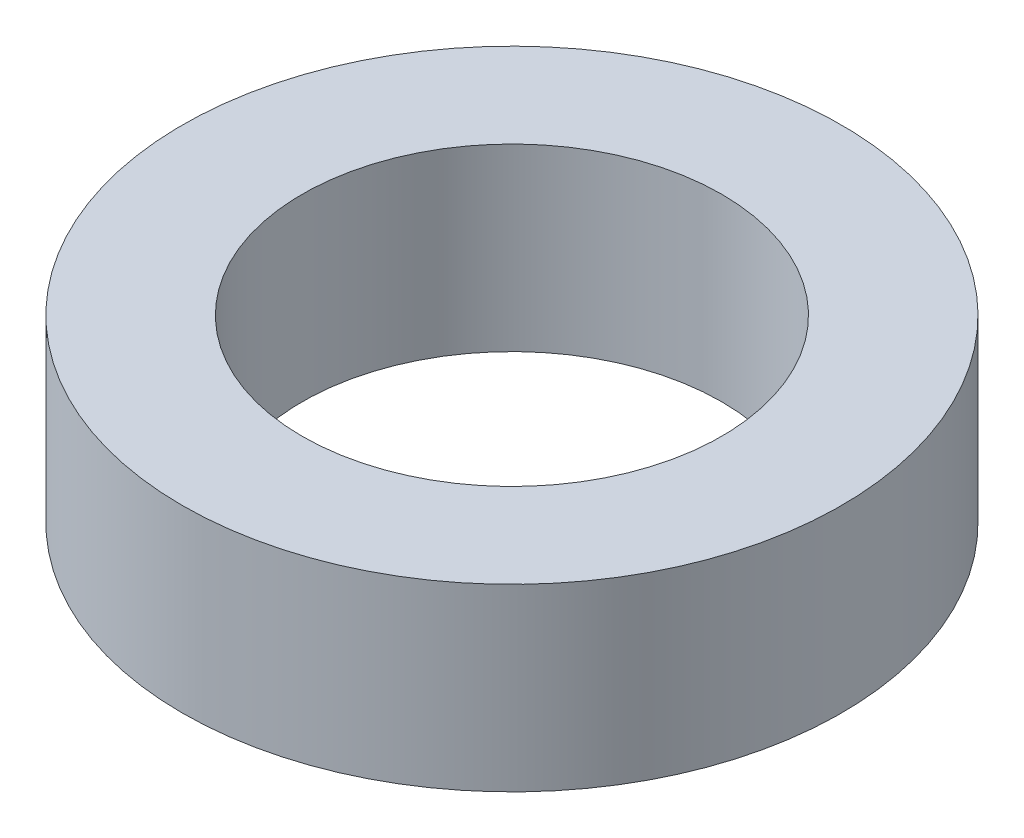
ISO-10303-21;
HEADER;
FILE_DESCRIPTION(('STEP AP214'),'2;1');
FILE_NAME('part.step','',(''),(''),'','','');
FILE_SCHEMA(('AUTOMOTIVE_DESIGN { 1 0 10303 214 1 1 1 1 }'));
ENDSEC;
DATA;
#1=APPLICATION_CONTEXT('core data for automotive mechanical design processes');
#2=APPLICATION_PROTOCOL_DEFINITION('international standard','automotive_design',2000,#1);
#3=PRODUCT_CONTEXT('',#1,'mechanical');
#4=PRODUCT('Part','Part','',(#3));
#5=PRODUCT_RELATED_PRODUCT_CATEGORY('part','',(#4));
#6=PRODUCT_DEFINITION_FORMATION('','',#4);
#7=PRODUCT_DEFINITION_CONTEXT('part definition',#1,'design');
#8=PRODUCT_DEFINITION('design','',#6,#7);
#9=PRODUCT_DEFINITION_SHAPE('','',#8);
#10=(LENGTH_UNIT() NAMED_UNIT(*) SI_UNIT(.MILLI.,.METRE.));
#11=(NAMED_UNIT(*) PLANE_ANGLE_UNIT() SI_UNIT($,.RADIAN.));
#12=(NAMED_UNIT(*) SI_UNIT($,.STERADIAN.) SOLID_ANGLE_UNIT());
#13=UNCERTAINTY_MEASURE_WITH_UNIT(LENGTH_MEASURE(1.E-05),#10,'distance_accuracy_value','');
#14=(GEOMETRIC_REPRESENTATION_CONTEXT(3) GLOBAL_UNCERTAINTY_ASSIGNED_CONTEXT((#13)) GLOBAL_UNIT_ASSIGNED_CONTEXT((#10,
#11,#12)) REPRESENTATION_CONTEXT('',''));
#15=CARTESIAN_POINT('',(0.,0.,0.));
#16=DIRECTION('',(0.,0.,1.));
#17=DIRECTION('',(1.,0.,0.));
#18=AXIS2_PLACEMENT_3D('',#15,#16,#17);
#19=CARTESIAN_POINT('',(0.,3.,0.));
#20=DIRECTION('',(0.,1.,0.));
#21=DIRECTION('',(0.,0.,1.));
#22=AXIS2_PLACEMENT_3D('',#19,#20,#21);
#23=PLANE('',#22);
#24=CARTESIAN_POINT('',(0.,3.,0.));
#25=DIRECTION('',(0.,1.,0.));
#26=DIRECTION('',(0.,0.,1.));
#27=AXIS2_PLACEMENT_3D('',#24,#25,#26);
#28=CIRCLE('',#27,5.5);
#29=CARTESIAN_POINT('',(0.,3.,5.5));
#30=VERTEX_POINT('',#29);
#31=EDGE_CURVE('E10',#30,#30,#28,.T.);
#32=ORIENTED_EDGE('',*,*,#31,.T.);
#33=EDGE_LOOP('',(#32));
#34=FACE_BOUND('',#33,.T.);
#35=CARTESIAN_POINT('',(0.,3.,0.));
#36=DIRECTION('',(0.,1.,0.));
#37=DIRECTION('',(0.,0.,1.));
#38=AXIS2_PLACEMENT_3D('',#35,#36,#37);
#39=CIRCLE('',#38,3.5);
#40=CARTESIAN_POINT('',(0.,3.,3.5));
#41=VERTEX_POINT('',#40);
#42=EDGE_CURVE('E42',#41,#41,#39,.T.);
#43=ORIENTED_EDGE('',*,*,#42,.F.);
#44=EDGE_LOOP('',(#43));
#45=FACE_BOUND('',#44,.T.);
#46=ADVANCED_FACE('F31',(#34,#45),#23,.T.);
#47=CARTESIAN_POINT('',(0.,0.,0.));
#48=DIRECTION('',(0.,1.,0.));
#49=DIRECTION('',(0.,0.,1.));
#50=AXIS2_PLACEMENT_3D('',#47,#48,#49);
#51=PLANE('',#50);
#52=CARTESIAN_POINT('',(0.,0.,0.));
#53=DIRECTION('',(0.,1.,0.));
#54=DIRECTION('',(0.,0.,1.));
#55=AXIS2_PLACEMENT_3D('',#52,#53,#54);
#56=CIRCLE('',#55,5.5);
#57=CARTESIAN_POINT('',(0.,0.,5.5));
#58=VERTEX_POINT('',#57);
#59=EDGE_CURVE('E35',#58,#58,#56,.T.);
#60=ORIENTED_EDGE('',*,*,#59,.F.);
#61=EDGE_LOOP('',(#60));
#62=FACE_BOUND('',#61,.T.);
#63=CARTESIAN_POINT('',(0.,0.,0.));
#64=DIRECTION('',(0.,1.,0.));
#65=DIRECTION('',(0.,0.,1.));
#66=AXIS2_PLACEMENT_3D('',#63,#64,#65);
#67=CIRCLE('',#66,3.5);
#68=CARTESIAN_POINT('',(0.,0.,3.5));
#69=VERTEX_POINT('',#68);
#70=EDGE_CURVE('E44',#69,#69,#67,.T.);
#71=ORIENTED_EDGE('',*,*,#70,.T.);
#72=EDGE_LOOP('',(#71));
#73=FACE_BOUND('',#72,.T.);
#74=ADVANCED_FACE('F54',(#62,#73),#51,.F.);
#75=CARTESIAN_POINT('',(0.,3.,0.));
#76=DIRECTION('',(0.,-1.,0.));
#77=DIRECTION('',(0.,0.,-1.));
#78=AXIS2_PLACEMENT_3D('',#75,#76,#77);
#79=CYLINDRICAL_SURFACE('',#78,5.5);
#80=ORIENTED_EDGE('',*,*,#31,.F.);
#81=EDGE_LOOP('',(#80));
#82=FACE_BOUND('',#81,.T.);
#83=ORIENTED_EDGE('',*,*,#59,.T.);
#84=EDGE_LOOP('',(#83));
#85=FACE_BOUND('',#84,.T.);
#86=ADVANCED_FACE('F33',(#82,#85),#79,.T.);
#87=CARTESIAN_POINT('',(0.,3.,0.));
#88=DIRECTION('',(0.,-1.,0.));
#89=DIRECTION('',(0.,0.,-1.));
#90=AXIS2_PLACEMENT_3D('',#87,#88,#89);
#91=CYLINDRICAL_SURFACE('',#90,3.5);
#92=ORIENTED_EDGE('',*,*,#42,.T.);
#93=EDGE_LOOP('',(#92));
#94=FACE_BOUND('',#93,.T.);
#95=ORIENTED_EDGE('',*,*,#70,.F.);
#96=EDGE_LOOP('',(#95));
#97=FACE_BOUND('',#96,.T.);
#98=ADVANCED_FACE('F50',(#94,#97),#91,.F.);
#99=CLOSED_SHELL('',(#46,#74,#86,#98));
#100=MANIFOLD_SOLID_BREP('B2',#99);
#101=ADVANCED_BREP_SHAPE_REPRESENTATION('',(#18,#100),#14);
#102=SHAPE_DEFINITION_REPRESENTATION(#9,#101);
ENDSEC;
END-ISO-10303-21;
